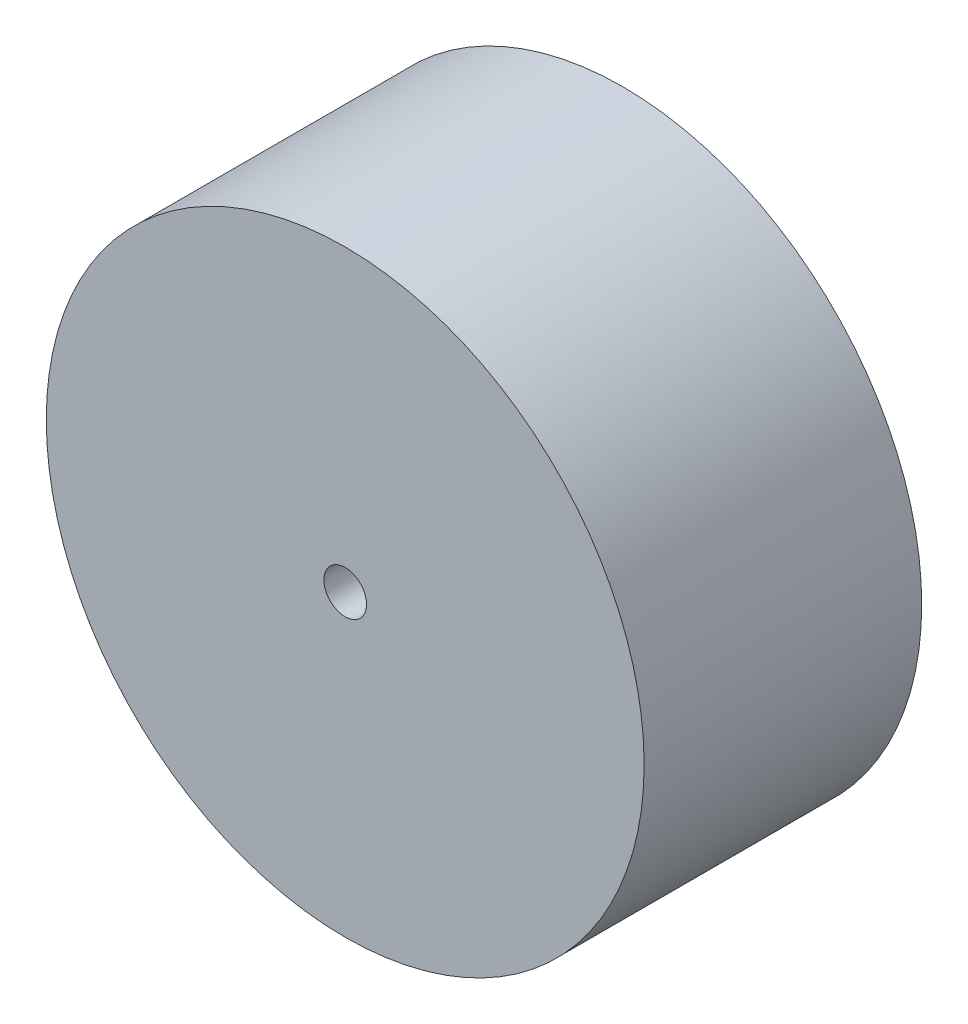
ISO-10303-21;
HEADER;
FILE_DESCRIPTION(('STEP AP214'),'2;1');
FILE_NAME('part.step','',(''),(''),'','','');
FILE_SCHEMA(('AUTOMOTIVE_DESIGN { 1 0 10303 214 1 1 1 1 }'));
ENDSEC;
DATA;
#1=APPLICATION_CONTEXT('core data for automotive mechanical design processes');
#2=APPLICATION_PROTOCOL_DEFINITION('international standard','automotive_design',2000,#1);
#3=PRODUCT_CONTEXT('',#1,'mechanical');
#4=PRODUCT('Part','Part','',(#3));
#5=PRODUCT_RELATED_PRODUCT_CATEGORY('part','',(#4));
#6=PRODUCT_DEFINITION_FORMATION('','',#4);
#7=PRODUCT_DEFINITION_CONTEXT('part definition',#1,'design');
#8=PRODUCT_DEFINITION('design','',#6,#7);
#9=PRODUCT_DEFINITION_SHAPE('','',#8);
#10=(LENGTH_UNIT() NAMED_UNIT(*) SI_UNIT(.MILLI.,.METRE.));
#11=(NAMED_UNIT(*) PLANE_ANGLE_UNIT() SI_UNIT($,.RADIAN.));
#12=(NAMED_UNIT(*) SI_UNIT($,.STERADIAN.) SOLID_ANGLE_UNIT());
#13=UNCERTAINTY_MEASURE_WITH_UNIT(LENGTH_MEASURE(1.E-05),#10,'distance_accuracy_value','');
#14=(GEOMETRIC_REPRESENTATION_CONTEXT(3) GLOBAL_UNCERTAINTY_ASSIGNED_CONTEXT((#13)) GLOBAL_UNIT_ASSIGNED_CONTEXT((#10,
#11,#12)) REPRESENTATION_CONTEXT('',''));
#15=CARTESIAN_POINT('',(0.,0.,0.));
#16=DIRECTION('',(0.,0.,1.));
#17=DIRECTION('',(1.,0.,0.));
#18=AXIS2_PLACEMENT_3D('',#15,#16,#17);
#19=CARTESIAN_POINT('',(0.,0.,26.));
#20=DIRECTION('',(0.,0.,-1.));
#21=DIRECTION('',(-1.,0.,0.));
#22=AXIS2_PLACEMENT_3D('',#19,#20,#21);
#23=CYLINDRICAL_SURFACE('',#22,28.);
#24=CARTESIAN_POINT('',(0.,0.,26.));
#25=DIRECTION('',(0.,0.,1.));
#26=DIRECTION('',(1.,0.,0.));
#27=AXIS2_PLACEMENT_3D('',#24,#25,#26);
#28=CIRCLE('',#27,28.);
#29=CARTESIAN_POINT('',(-28.,0.,26.));
#30=VERTEX_POINT('',#29);
#31=EDGE_CURVE('E10',#30,#30,#28,.T.);
#32=CARTESIAN_POINT('',(0.,0.,0.));
#33=DIRECTION('',(0.,0.,1.));
#34=DIRECTION('',(1.,0.,0.));
#35=AXIS2_PLACEMENT_3D('',#32,#33,#34);
#36=CIRCLE('',#35,28.);
#37=CARTESIAN_POINT('',(-28.,0.,0.));
#38=VERTEX_POINT('',#37);
#39=EDGE_CURVE('E46',#38,#38,#36,.T.);
#40=CARTESIAN_POINT('',(-28.,0.,26.));
#41=CARTESIAN_POINT('',(-28.,0.,25.7291666666667));
#42=CARTESIAN_POINT('',(-28.,0.,25.4583333333333));
#43=CARTESIAN_POINT('',(-28.,0.,24.9166666666667));
#44=CARTESIAN_POINT('',(-28.,0.,24.6458333333333));
#45=CARTESIAN_POINT('',(-28.,0.,24.1041666666667));
#46=CARTESIAN_POINT('',(-28.,0.,23.8333333333333));
#47=CARTESIAN_POINT('',(-28.,0.,23.2916666666667));
#48=CARTESIAN_POINT('',(-28.,0.,23.0208333333333));
#49=CARTESIAN_POINT('',(-28.,0.,22.4791666666667));
#50=CARTESIAN_POINT('',(-28.,0.,22.2083333333333));
#51=CARTESIAN_POINT('',(-28.,0.,21.6666666666667));
#52=CARTESIAN_POINT('',(-28.,0.,21.3958333333333));
#53=CARTESIAN_POINT('',(-28.,0.,20.8541666666667));
#54=CARTESIAN_POINT('',(-28.,0.,20.5833333333333));
#55=CARTESIAN_POINT('',(-28.,0.,20.0416666666667));
#56=CARTESIAN_POINT('',(-28.,0.,19.7708333333333));
#57=CARTESIAN_POINT('',(-28.,0.,19.2291666666667));
#58=CARTESIAN_POINT('',(-28.,0.,18.9583333333333));
#59=CARTESIAN_POINT('',(-28.,0.,18.4166666666667));
#60=CARTESIAN_POINT('',(-28.,0.,18.1458333333333));
#61=CARTESIAN_POINT('',(-28.,0.,17.6041666666667));
#62=CARTESIAN_POINT('',(-28.,0.,17.3333333333333));
#63=CARTESIAN_POINT('',(-28.,0.,16.7916666666667));
#64=CARTESIAN_POINT('',(-28.,0.,16.5208333333333));
#65=CARTESIAN_POINT('',(-28.,0.,15.9791666666667));
#66=CARTESIAN_POINT('',(-28.,0.,15.7083333333333));
#67=CARTESIAN_POINT('',(-28.,0.,15.1666666666667));
#68=CARTESIAN_POINT('',(-28.,0.,14.8958333333333));
#69=CARTESIAN_POINT('',(-28.,0.,14.3541666666667));
#70=CARTESIAN_POINT('',(-28.,0.,14.0833333333333));
#71=CARTESIAN_POINT('',(-28.,0.,13.5416666666667));
#72=CARTESIAN_POINT('',(-28.,0.,13.2708333333333));
#73=CARTESIAN_POINT('',(-28.,0.,12.7291666666667));
#74=CARTESIAN_POINT('',(-28.,0.,12.4583333333333));
#75=CARTESIAN_POINT('',(-28.,0.,11.9166666666667));
#76=CARTESIAN_POINT('',(-28.,0.,11.6458333333333));
#77=CARTESIAN_POINT('',(-28.,0.,11.1041666666667));
#78=CARTESIAN_POINT('',(-28.,0.,10.8333333333333));
#79=CARTESIAN_POINT('',(-28.,0.,10.2916666666667));
#80=CARTESIAN_POINT('',(-28.,0.,10.0208333333333));
#81=CARTESIAN_POINT('',(-28.,0.,9.47916666666667));
#82=CARTESIAN_POINT('',(-28.,0.,9.20833333333333));
#83=CARTESIAN_POINT('',(-28.,0.,8.66666666666667));
#84=CARTESIAN_POINT('',(-28.,0.,8.39583333333333));
#85=CARTESIAN_POINT('',(-28.,0.,7.85416666666667));
#86=CARTESIAN_POINT('',(-28.,0.,7.58333333333333));
#87=CARTESIAN_POINT('',(-28.,0.,7.04166666666667));
#88=CARTESIAN_POINT('',(-28.,0.,6.77083333333333));
#89=CARTESIAN_POINT('',(-28.,0.,6.22916666666667));
#90=CARTESIAN_POINT('',(-28.,0.,5.95833333333333));
#91=CARTESIAN_POINT('',(-28.,0.,5.41666666666667));
#92=CARTESIAN_POINT('',(-28.,0.,5.14583333333333));
#93=CARTESIAN_POINT('',(-28.,0.,4.60416666666667));
#94=CARTESIAN_POINT('',(-28.,0.,4.33333333333333));
#95=CARTESIAN_POINT('',(-28.,0.,3.79166666666667));
#96=CARTESIAN_POINT('',(-28.,0.,3.52083333333333));
#97=CARTESIAN_POINT('',(-28.,0.,2.97916666666667));
#98=CARTESIAN_POINT('',(-28.,0.,2.70833333333333));
#99=CARTESIAN_POINT('',(-28.,0.,2.16666666666667));
#100=CARTESIAN_POINT('',(-28.,0.,1.89583333333333));
#101=CARTESIAN_POINT('',(-28.,0.,1.35416666666667));
#102=CARTESIAN_POINT('',(-28.,0.,1.08333333333333));
#103=CARTESIAN_POINT('',(-28.,0.,0.541666666666667));
#104=CARTESIAN_POINT('',(-28.,0.,0.270833333333334));
#105=CARTESIAN_POINT('',(-28.,0.,0.));
#106=B_SPLINE_CURVE_WITH_KNOTS('',3,(#40,#41,#42,#43,#44,#45,#46,#47,#48,#49,#50,#51,#52,#53,
#54,#55,#56,#57,#58,#59,#60,#61,#62,#63,#64,#65,#66,#67,#68,#69,#70,#71,#72,#73,#74,#75,#76,#77,
#78,#79,#80,#81,#82,#83,#84,#85,#86,#87,#88,#89,#90,#91,#92,#93,#94,#95,#96,#97,#98,#99,#100,
#101,#102,#103,#104,#105),.UNSPECIFIED.,.F.,.F.,(4,2,2,2,2,2,2,2,2,2,2,2,2,2,2,2,2,2,2,2,2,2,2,
2,2,2,2,2,2,2,2,2,4),(0.,0.812499999999997,1.625,2.4375,3.25,4.0625,4.875,5.6875,6.5,7.3125,
8.125,8.93749999999999,9.74999999999999,10.5625,11.375,12.1875,13.,13.8125,14.625,15.4375,16.25,
17.0625,17.875,18.6875,19.5,20.3125,21.125,21.9375,22.75,23.5625,24.375,25.1875,26.),.UNSPECIFIED.);
#107=EDGE_CURVE('BSEAM43',#30,#38,#106,.T.);
#108=ORIENTED_EDGE('',*,*,#31,.F.);
#109=ORIENTED_EDGE('',*,*,#39,.T.);
#110=ORIENTED_EDGE('',*,*,#107,.T.);
#111=ORIENTED_EDGE('',*,*,#107,.F.);
#112=EDGE_LOOP('',(#108,#110,#109,#111));
#113=FACE_BOUND('',#112,.T.);
#114=ADVANCED_FACE('F43',(#113),#23,.T.);
#115=CARTESIAN_POINT('',(0.,0.,26.));
#116=DIRECTION('',(0.,0.,1.));
#117=DIRECTION('',(1.,0.,0.));
#118=AXIS2_PLACEMENT_3D('',#115,#116,#117);
#119=PLANE('',#118);
#120=CARTESIAN_POINT('',(0.,0.,26.));
#121=DIRECTION('',(0.,0.,1.));
#122=DIRECTION('',(1.,0.,0.));
#123=AXIS2_PLACEMENT_3D('',#120,#121,#122);
#124=CIRCLE('',#123,2.);
#125=CARTESIAN_POINT('',(2.,0.,26.));
#126=VERTEX_POINT('',#125);
#127=EDGE_CURVE('E57',#126,#126,#124,.T.);
#128=ORIENTED_EDGE('',*,*,#127,.F.);
#129=EDGE_LOOP('',(#128));
#130=FACE_BOUND('',#129,.T.);
#131=ORIENTED_EDGE('',*,*,#31,.T.);
#132=EDGE_LOOP('',(#131));
#133=FACE_BOUND('',#132,.T.);
#134=ADVANCED_FACE('F74',(#130,#133),#119,.T.);
#135=CARTESIAN_POINT('',(0.,0.,0.));
#136=DIRECTION('',(0.,0.,1.));
#137=DIRECTION('',(1.,0.,0.));
#138=AXIS2_PLACEMENT_3D('',#135,#136,#137);
#139=PLANE('',#138);
#140=CARTESIAN_POINT('',(0.,0.,0.));
#141=DIRECTION('',(0.,0.,1.));
#142=DIRECTION('',(1.,0.,0.));
#143=AXIS2_PLACEMENT_3D('',#140,#141,#142);
#144=CIRCLE('',#143,2.);
#145=CARTESIAN_POINT('',(2.,0.,0.));
#146=VERTEX_POINT('',#145);
#147=EDGE_CURVE('E55',#146,#146,#144,.T.);
#148=ORIENTED_EDGE('',*,*,#147,.T.);
#149=EDGE_LOOP('',(#148));
#150=FACE_BOUND('',#149,.T.);
#151=ORIENTED_EDGE('',*,*,#39,.F.);
#152=EDGE_LOOP('',(#151));
#153=FACE_BOUND('',#152,.T.);
#154=ADVANCED_FACE('F65',(#150,#153),#139,.F.);
#155=CARTESIAN_POINT('',(0.,0.,0.));
#156=DIRECTION('',(0.,0.,1.));
#157=DIRECTION('',(1.,0.,0.));
#158=AXIS2_PLACEMENT_3D('',#155,#156,#157);
#159=CYLINDRICAL_SURFACE('',#158,2.);
#160=CARTESIAN_POINT('',(2.,0.,0.));
#161=CARTESIAN_POINT('',(2.,0.,0.270833333333333));
#162=CARTESIAN_POINT('',(2.,0.,0.541666666666667));
#163=CARTESIAN_POINT('',(2.,0.,1.08333333333333));
#164=CARTESIAN_POINT('',(2.,0.,1.35416666666667));
#165=CARTESIAN_POINT('',(2.,0.,1.89583333333333));
#166=CARTESIAN_POINT('',(2.,0.,2.16666666666667));
#167=CARTESIAN_POINT('',(2.,0.,2.70833333333333));
#168=CARTESIAN_POINT('',(2.,0.,2.97916666666667));
#169=CARTESIAN_POINT('',(2.,0.,3.52083333333333));
#170=CARTESIAN_POINT('',(2.,0.,3.79166666666667));
#171=CARTESIAN_POINT('',(2.,0.,4.33333333333333));
#172=CARTESIAN_POINT('',(2.,0.,4.60416666666667));
#173=CARTESIAN_POINT('',(2.,0.,5.14583333333333));
#174=CARTESIAN_POINT('',(2.,0.,5.41666666666667));
#175=CARTESIAN_POINT('',(2.,0.,5.95833333333333));
#176=CARTESIAN_POINT('',(2.,0.,6.22916666666667));
#177=CARTESIAN_POINT('',(2.,0.,6.77083333333333));
#178=CARTESIAN_POINT('',(2.,0.,7.04166666666667));
#179=CARTESIAN_POINT('',(2.,0.,7.58333333333333));
#180=CARTESIAN_POINT('',(2.,0.,7.85416666666667));
#181=CARTESIAN_POINT('',(2.,0.,8.39583333333333));
#182=CARTESIAN_POINT('',(2.,0.,8.66666666666667));
#183=CARTESIAN_POINT('',(2.,0.,9.20833333333333));
#184=CARTESIAN_POINT('',(2.,0.,9.47916666666667));
#185=CARTESIAN_POINT('',(2.,0.,10.0208333333333));
#186=CARTESIAN_POINT('',(2.,0.,10.2916666666667));
#187=CARTESIAN_POINT('',(2.,0.,10.8333333333333));
#188=CARTESIAN_POINT('',(2.,0.,11.1041666666667));
#189=CARTESIAN_POINT('',(2.,0.,11.6458333333333));
#190=CARTESIAN_POINT('',(2.,0.,11.9166666666667));
#191=CARTESIAN_POINT('',(2.,0.,12.4583333333333));
#192=CARTESIAN_POINT('',(2.,0.,12.7291666666667));
#193=CARTESIAN_POINT('',(2.,0.,13.2708333333333));
#194=CARTESIAN_POINT('',(2.,0.,13.5416666666667));
#195=CARTESIAN_POINT('',(2.,0.,14.0833333333333));
#196=CARTESIAN_POINT('',(2.,0.,14.3541666666667));
#197=CARTESIAN_POINT('',(2.,0.,14.8958333333333));
#198=CARTESIAN_POINT('',(2.,0.,15.1666666666667));
#199=CARTESIAN_POINT('',(2.,0.,15.7083333333333));
#200=CARTESIAN_POINT('',(2.,0.,15.9791666666667));
#201=CARTESIAN_POINT('',(2.,0.,16.5208333333333));
#202=CARTESIAN_POINT('',(2.,0.,16.7916666666667));
#203=CARTESIAN_POINT('',(2.,0.,17.3333333333333));
#204=CARTESIAN_POINT('',(2.,0.,17.6041666666667));
#205=CARTESIAN_POINT('',(2.,0.,18.1458333333333));
#206=CARTESIAN_POINT('',(2.,0.,18.4166666666667));
#207=CARTESIAN_POINT('',(2.,0.,18.9583333333333));
#208=CARTESIAN_POINT('',(2.,0.,19.2291666666667));
#209=CARTESIAN_POINT('',(2.,0.,19.7708333333333));
#210=CARTESIAN_POINT('',(2.,0.,20.0416666666667));
#211=CARTESIAN_POINT('',(2.,0.,20.5833333333333));
#212=CARTESIAN_POINT('',(2.,0.,20.8541666666667));
#213=CARTESIAN_POINT('',(2.,0.,21.3958333333333));
#214=CARTESIAN_POINT('',(2.,0.,21.6666666666667));
#215=CARTESIAN_POINT('',(2.,0.,22.2083333333333));
#216=CARTESIAN_POINT('',(2.,0.,22.4791666666667));
#217=CARTESIAN_POINT('',(2.,0.,23.0208333333333));
#218=CARTESIAN_POINT('',(2.,0.,23.2916666666667));
#219=CARTESIAN_POINT('',(2.,0.,23.8333333333333));
#220=CARTESIAN_POINT('',(2.,0.,24.1041666666667));
#221=CARTESIAN_POINT('',(2.,0.,24.6458333333333));
#222=CARTESIAN_POINT('',(2.,0.,24.9166666666667));
#223=CARTESIAN_POINT('',(2.,0.,25.4583333333333));
#224=CARTESIAN_POINT('',(2.,0.,25.7291666666667));
#225=CARTESIAN_POINT('',(2.,0.,26.));
#226=B_SPLINE_CURVE_WITH_KNOTS('',3,(#160,#161,#162,#163,#164,#165,#166,#167,#168,#169,#170,
#171,#172,#173,#174,#175,#176,#177,#178,#179,#180,#181,#182,#183,#184,#185,#186,#187,#188,#189,
#190,#191,#192,#193,#194,#195,#196,#197,#198,#199,#200,#201,#202,#203,#204,#205,#206,#207,#208,
#209,#210,#211,#212,#213,#214,#215,#216,#217,#218,#219,#220,#221,#222,#223,#224,#225),
.UNSPECIFIED.,.F.,.F.,(4,2,2,2,2,2,2,2,2,2,2,2,2,2,2,2,2,2,2,2,2,2,2,2,2,2,2,2,2,2,2,2,4),(0.,
0.8125,1.625,2.4375,3.25,4.0625,4.875,5.6875,6.5,7.3125,8.125,8.9375,9.75,10.5625,11.375,
12.1875,13.,13.8125,14.625,15.4375,16.25,17.0625,17.875,18.6875,19.5,20.3125,21.125,21.9375,
22.75,23.5625,24.375,25.1875,26.),.UNSPECIFIED.);
#227=EDGE_CURVE('BSEAM68',#146,#126,#226,.T.);
#228=ORIENTED_EDGE('',*,*,#147,.F.);
#229=ORIENTED_EDGE('',*,*,#127,.T.);
#230=ORIENTED_EDGE('',*,*,#227,.T.);
#231=ORIENTED_EDGE('',*,*,#227,.F.);
#232=EDGE_LOOP('',(#228,#230,#229,#231));
#233=FACE_BOUND('',#232,.T.);
#234=ADVANCED_FACE('F68',(#233),#159,.F.);
#235=CLOSED_SHELL('',(#114,#134,#154,#234));
#236=MANIFOLD_SOLID_BREP('B2',#235);
#237=ADVANCED_BREP_SHAPE_REPRESENTATION('',(#18,#236),#14);
#238=SHAPE_DEFINITION_REPRESENTATION(#9,#237);
ENDSEC;
END-ISO-10303-21;
